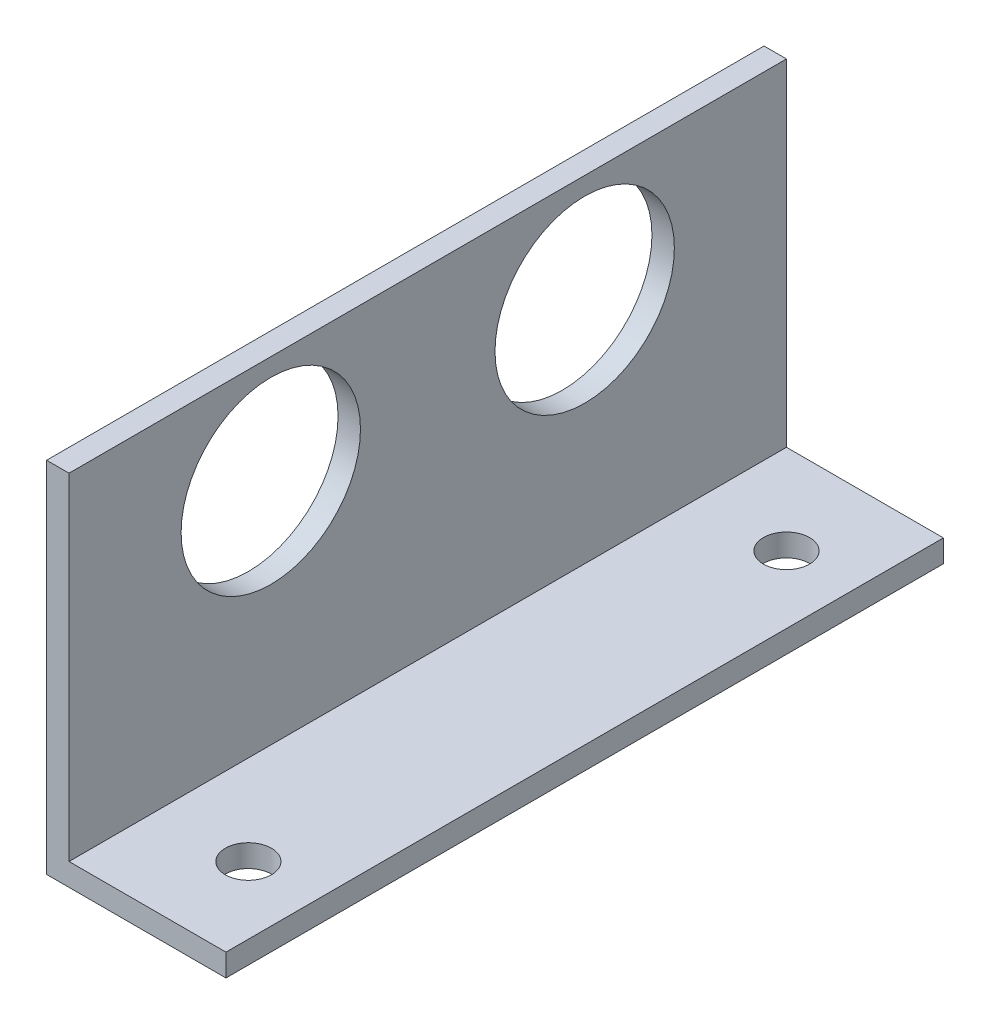
ISO-10303-21;
HEADER;
FILE_DESCRIPTION(('STEP AP214'),'2;1');
FILE_NAME('part.step','',(''),(''),'','','');
FILE_SCHEMA(('AUTOMOTIVE_DESIGN { 1 0 10303 214 1 1 1 1 }'));
ENDSEC;
DATA;
#1=APPLICATION_CONTEXT('core data for automotive mechanical design processes');
#2=APPLICATION_PROTOCOL_DEFINITION('international standard','automotive_design',2000,#1);
#3=PRODUCT_CONTEXT('',#1,'mechanical');
#4=PRODUCT('Part','Part','',(#3));
#5=PRODUCT_RELATED_PRODUCT_CATEGORY('part','',(#4));
#6=PRODUCT_DEFINITION_FORMATION('','',#4);
#7=PRODUCT_DEFINITION_CONTEXT('part definition',#1,'design');
#8=PRODUCT_DEFINITION('design','',#6,#7);
#9=PRODUCT_DEFINITION_SHAPE('','',#8);
#10=(LENGTH_UNIT() NAMED_UNIT(*) SI_UNIT(.MILLI.,.METRE.));
#11=(NAMED_UNIT(*) PLANE_ANGLE_UNIT() SI_UNIT($,.RADIAN.));
#12=(NAMED_UNIT(*) SI_UNIT($,.STERADIAN.) SOLID_ANGLE_UNIT());
#13=UNCERTAINTY_MEASURE_WITH_UNIT(LENGTH_MEASURE(1.E-05),#10,'distance_accuracy_value','');
#14=(GEOMETRIC_REPRESENTATION_CONTEXT(3) GLOBAL_UNCERTAINTY_ASSIGNED_CONTEXT((#13)) GLOBAL_UNIT_ASSIGNED_CONTEXT((#10,
#11,#12)) REPRESENTATION_CONTEXT('',''));
#15=CARTESIAN_POINT('',(0.,0.,0.));
#16=DIRECTION('',(0.,0.,1.));
#17=DIRECTION('',(1.,0.,0.));
#18=AXIS2_PLACEMENT_3D('',#15,#16,#17);
#19=CARTESIAN_POINT('',(0.,25.4,25.4));
#20=DIRECTION('',(1.,0.,0.));
#21=DIRECTION('',(0.,0.,-1.));
#22=AXIS2_PLACEMENT_3D('',#19,#20,#21);
#23=PLANE('',#22);
#24=CARTESIAN_POINT('',(0.,17.78,-11.1125));
#25=DIRECTION('',(-1.,0.,0.));
#26=DIRECTION('',(0.,0.,1.));
#27=AXIS2_PLACEMENT_3D('',#24,#25,#26);
#28=CIRCLE('',#27,6.35);
#29=CARTESIAN_POINT('',(0.,17.78,-4.7625));
#30=VERTEX_POINT('',#29);
#31=EDGE_CURVE('E144',#30,#30,#28,.T.);
#32=ORIENTED_EDGE('',*,*,#31,.F.);
#33=EDGE_LOOP('',(#32));
#34=FACE_BOUND('',#33,.T.);
#35=CARTESIAN_POINT('',(0.,17.78,11.1125));
#36=DIRECTION('',(-1.,0.,0.));
#37=DIRECTION('',(0.,0.,1.));
#38=AXIS2_PLACEMENT_3D('',#35,#36,#37);
#39=CIRCLE('',#38,6.35000000000001);
#40=CARTESIAN_POINT('',(0.,17.78,17.4625));
#41=VERTEX_POINT('',#40);
#42=EDGE_CURVE('E136',#41,#41,#39,.T.);
#43=ORIENTED_EDGE('',*,*,#42,.F.);
#44=EDGE_LOOP('',(#43));
#45=FACE_BOUND('',#44,.T.);
#46=DIRECTION('',(0.,-1.,0.));
#47=VECTOR('',#46,1.);
#48=CARTESIAN_POINT('',(0.,25.4,-25.4));
#49=LINE('',#48,#47);
#50=CARTESIAN_POINT('',(0.,25.4,-25.4));
#51=VERTEX_POINT('',#50);
#52=CARTESIAN_POINT('',(0.,0.,-25.4));
#53=VERTEX_POINT('',#52);
#54=EDGE_CURVE('E119',#51,#53,#49,.T.);
#55=ORIENTED_EDGE('',*,*,#54,.T.);
#56=DIRECTION('',(0.,0.,-1.));
#57=VECTOR('',#56,1.);
#58=CARTESIAN_POINT('',(0.,0.,25.4));
#59=LINE('',#58,#57);
#60=CARTESIAN_POINT('',(0.,0.,25.4));
#61=VERTEX_POINT('',#60);
#62=EDGE_CURVE('E11',#61,#53,#59,.T.);
#63=ORIENTED_EDGE('',*,*,#62,.F.);
#64=DIRECTION('',(0.,-1.,0.));
#65=VECTOR('',#64,1.);
#66=CARTESIAN_POINT('',(0.,25.4,25.4));
#67=LINE('',#66,#65);
#68=CARTESIAN_POINT('',(0.,25.4,25.4));
#69=VERTEX_POINT('',#68);
#70=EDGE_CURVE('E130',#69,#61,#67,.T.);
#71=ORIENTED_EDGE('',*,*,#70,.F.);
#72=DIRECTION('',(0.,0.,-1.));
#73=VECTOR('',#72,1.);
#74=CARTESIAN_POINT('',(0.,25.4,25.4));
#75=LINE('',#74,#73);
#76=EDGE_CURVE('E115',#69,#51,#75,.T.);
#77=ORIENTED_EDGE('',*,*,#76,.T.);
#78=EDGE_LOOP('',(#55,#63,#71,#77));
#79=FACE_BOUND('',#78,.T.);
#80=ADVANCED_FACE('F33',(#34,#45,#79),#23,.F.);
#81=CARTESIAN_POINT('',(0.,0.,25.4));
#82=DIRECTION('',(0.,1.,0.));
#83=DIRECTION('',(0.,0.,1.));
#84=AXIS2_PLACEMENT_3D('',#81,#82,#83);
#85=PLANE('',#84);
#86=CARTESIAN_POINT('',(7.9375,0.,-19.05));
#87=DIRECTION('',(0.,1.,0.));
#88=DIRECTION('',(0.,0.,1.));
#89=AXIS2_PLACEMENT_3D('',#86,#87,#88);
#90=CIRCLE('',#89,1.63195);
#91=CARTESIAN_POINT('',(7.9375,0.,-17.41805));
#92=VERTEX_POINT('',#91);
#93=EDGE_CURVE('E186',#92,#92,#90,.T.);
#94=ORIENTED_EDGE('',*,*,#93,.T.);
#95=EDGE_LOOP('',(#94));
#96=FACE_BOUND('',#95,.T.);
#97=CARTESIAN_POINT('',(7.9375,0.,19.05));
#98=DIRECTION('',(0.,1.,0.));
#99=DIRECTION('',(0.,0.,1.));
#100=AXIS2_PLACEMENT_3D('',#97,#98,#99);
#101=CIRCLE('',#100,1.63195);
#102=CARTESIAN_POINT('',(7.9375,0.,20.68195));
#103=VERTEX_POINT('',#102);
#104=EDGE_CURVE('E180',#103,#103,#101,.T.);
#105=ORIENTED_EDGE('',*,*,#104,.T.);
#106=EDGE_LOOP('',(#105));
#107=FACE_BOUND('',#106,.T.);
#108=DIRECTION('',(1.,0.,0.));
#109=VECTOR('',#108,1.);
#110=CARTESIAN_POINT('',(0.,0.,-25.4));
#111=LINE('',#110,#109);
#112=CARTESIAN_POINT('',(12.7,0.,-25.4));
#113=VERTEX_POINT('',#112);
#114=EDGE_CURVE('E122',#53,#113,#111,.T.);
#115=ORIENTED_EDGE('',*,*,#114,.T.);
#116=DIRECTION('',(0.,0.,-1.));
#117=VECTOR('',#116,1.);
#118=CARTESIAN_POINT('',(12.7,0.,25.4));
#119=LINE('',#118,#117);
#120=CARTESIAN_POINT('',(12.7,0.,25.4));
#121=VERTEX_POINT('',#120);
#122=EDGE_CURVE('E42',#121,#113,#119,.T.);
#123=ORIENTED_EDGE('',*,*,#122,.F.);
#124=DIRECTION('',(1.,0.,0.));
#125=VECTOR('',#124,1.);
#126=CARTESIAN_POINT('',(0.,0.,25.4));
#127=LINE('',#126,#125);
#128=EDGE_CURVE('E88',#61,#121,#127,.T.);
#129=ORIENTED_EDGE('',*,*,#128,.F.);
#130=ORIENTED_EDGE('',*,*,#62,.T.);
#131=EDGE_LOOP('',(#115,#123,#129,#130));
#132=FACE_BOUND('',#131,.T.);
#133=ADVANCED_FACE('F151',(#96,#107,#132),#85,.F.);
#134=CARTESIAN_POINT('',(12.7,0.,25.4));
#135=DIRECTION('',(-1.,0.,0.));
#136=DIRECTION('',(0.,0.,1.));
#137=AXIS2_PLACEMENT_3D('',#134,#135,#136);
#138=PLANE('',#137);
#139=DIRECTION('',(0.,1.,0.));
#140=VECTOR('',#139,1.);
#141=CARTESIAN_POINT('',(12.7,0.,-25.4));
#142=LINE('',#141,#140);
#143=CARTESIAN_POINT('',(12.7,1.5875,-25.4));
#144=VERTEX_POINT('',#143);
#145=EDGE_CURVE('E125',#113,#144,#142,.T.);
#146=ORIENTED_EDGE('',*,*,#145,.T.);
#147=DIRECTION('',(0.,0.,-1.));
#148=VECTOR('',#147,1.);
#149=CARTESIAN_POINT('',(12.7,1.5875,25.4));
#150=LINE('',#149,#148);
#151=CARTESIAN_POINT('',(12.7,1.5875,25.4));
#152=VERTEX_POINT('',#151);
#153=EDGE_CURVE('E110',#152,#144,#150,.T.);
#154=ORIENTED_EDGE('',*,*,#153,.F.);
#155=DIRECTION('',(0.,1.,0.));
#156=VECTOR('',#155,1.);
#157=CARTESIAN_POINT('',(12.7,0.,25.4));
#158=LINE('',#157,#156);
#159=EDGE_CURVE('E101',#121,#152,#158,.T.);
#160=ORIENTED_EDGE('',*,*,#159,.F.);
#161=ORIENTED_EDGE('',*,*,#122,.T.);
#162=EDGE_LOOP('',(#146,#154,#160,#161));
#163=FACE_BOUND('',#162,.T.);
#164=ADVANCED_FACE('F154',(#163),#138,.F.);
#165=CARTESIAN_POINT('',(12.7,1.5875,25.4));
#166=DIRECTION('',(0.,-1.,0.));
#167=DIRECTION('',(1.,0.,0.));
#168=AXIS2_PLACEMENT_3D('',#165,#166,#167);
#169=PLANE('',#168);
#170=CARTESIAN_POINT('',(7.9375,1.5875,-19.05));
#171=DIRECTION('',(0.,1.,0.));
#172=DIRECTION('',(0.,0.,1.));
#173=AXIS2_PLACEMENT_3D('',#170,#171,#172);
#174=CIRCLE('',#173,1.63195);
#175=CARTESIAN_POINT('',(7.9375,1.5875,-17.41805));
#176=VERTEX_POINT('',#175);
#177=EDGE_CURVE('E191',#176,#176,#174,.T.);
#178=ORIENTED_EDGE('',*,*,#177,.F.);
#179=EDGE_LOOP('',(#178));
#180=FACE_BOUND('',#179,.T.);
#181=CARTESIAN_POINT('',(7.9375,1.5875,19.05));
#182=DIRECTION('',(0.,1.,0.));
#183=DIRECTION('',(0.,0.,1.));
#184=AXIS2_PLACEMENT_3D('',#181,#182,#183);
#185=CIRCLE('',#184,1.63195);
#186=CARTESIAN_POINT('',(7.9375,1.5875,20.68195));
#187=VERTEX_POINT('',#186);
#188=EDGE_CURVE('E182',#187,#187,#185,.T.);
#189=ORIENTED_EDGE('',*,*,#188,.F.);
#190=EDGE_LOOP('',(#189));
#191=FACE_BOUND('',#190,.T.);
#192=DIRECTION('',(-1.,0.,0.));
#193=VECTOR('',#192,1.);
#194=CARTESIAN_POINT('',(12.7,1.5875,-25.4));
#195=LINE('',#194,#193);
#196=CARTESIAN_POINT('',(1.5875,1.5875,-25.4));
#197=VERTEX_POINT('',#196);
#198=EDGE_CURVE('E109',#144,#197,#195,.T.);
#199=ORIENTED_EDGE('',*,*,#198,.T.);
#200=DIRECTION('',(0.,0.,-1.));
#201=VECTOR('',#200,1.);
#202=CARTESIAN_POINT('',(1.5875,1.5875,25.4));
#203=LINE('',#202,#201);
#204=CARTESIAN_POINT('',(1.5875,1.5875,25.4));
#205=VERTEX_POINT('',#204);
#206=EDGE_CURVE('E106',#205,#197,#203,.T.);
#207=ORIENTED_EDGE('',*,*,#206,.F.);
#208=DIRECTION('',(-1.,0.,0.));
#209=VECTOR('',#208,1.);
#210=CARTESIAN_POINT('',(12.7,1.5875,25.4));
#211=LINE('',#210,#209);
#212=EDGE_CURVE('E95',#152,#205,#211,.T.);
#213=ORIENTED_EDGE('',*,*,#212,.F.);
#214=ORIENTED_EDGE('',*,*,#153,.T.);
#215=EDGE_LOOP('',(#199,#207,#213,#214));
#216=FACE_BOUND('',#215,.T.);
#217=ADVANCED_FACE('F107',(#180,#191,#216),#169,.F.);
#218=CARTESIAN_POINT('',(1.5875,1.5875,25.4));
#219=DIRECTION('',(-1.,0.,0.));
#220=DIRECTION('',(0.,-1.,0.));
#221=AXIS2_PLACEMENT_3D('',#218,#219,#220);
#222=PLANE('',#221);
#223=CARTESIAN_POINT('',(1.5875,17.78,-11.1125));
#224=DIRECTION('',(-1.,0.,0.));
#225=DIRECTION('',(0.,-1.,0.));
#226=AXIS2_PLACEMENT_3D('',#223,#224,#225);
#227=CIRCLE('',#226,6.35);
#228=CARTESIAN_POINT('',(1.5875,11.43,-11.1125));
#229=VERTEX_POINT('',#228);
#230=EDGE_CURVE('E36',#229,#229,#227,.T.);
#231=ORIENTED_EDGE('',*,*,#230,.T.);
#232=EDGE_LOOP('',(#231));
#233=FACE_BOUND('',#232,.T.);
#234=CARTESIAN_POINT('',(1.5875,17.78,11.1125));
#235=DIRECTION('',(-1.,0.,0.));
#236=DIRECTION('',(0.,-1.,0.));
#237=AXIS2_PLACEMENT_3D('',#234,#235,#236);
#238=CIRCLE('',#237,6.35000000000001);
#239=CARTESIAN_POINT('',(1.5875,11.43,11.1125));
#240=VERTEX_POINT('',#239);
#241=EDGE_CURVE('E123',#240,#240,#238,.T.);
#242=ORIENTED_EDGE('',*,*,#241,.T.);
#243=EDGE_LOOP('',(#242));
#244=FACE_BOUND('',#243,.T.);
#245=DIRECTION('',(0.,1.,0.));
#246=VECTOR('',#245,1.);
#247=CARTESIAN_POINT('',(1.5875,1.5875,-25.4));
#248=LINE('',#247,#246);
#249=CARTESIAN_POINT('',(1.5875,25.4,-25.4));
#250=VERTEX_POINT('',#249);
#251=EDGE_CURVE('E74',#197,#250,#248,.T.);
#252=ORIENTED_EDGE('',*,*,#251,.T.);
#253=DIRECTION('',(0.,0.,-1.));
#254=VECTOR('',#253,1.);
#255=CARTESIAN_POINT('',(1.5875,25.4,25.4));
#256=LINE('',#255,#254);
#257=CARTESIAN_POINT('',(1.5875,25.4,25.4));
#258=VERTEX_POINT('',#257);
#259=EDGE_CURVE('E111',#258,#250,#256,.T.);
#260=ORIENTED_EDGE('',*,*,#259,.F.);
#261=DIRECTION('',(0.,1.,0.));
#262=VECTOR('',#261,1.);
#263=CARTESIAN_POINT('',(1.5875,1.5875,25.4));
#264=LINE('',#263,#262);
#265=EDGE_CURVE('E99',#205,#258,#264,.T.);
#266=ORIENTED_EDGE('',*,*,#265,.F.);
#267=ORIENTED_EDGE('',*,*,#206,.T.);
#268=EDGE_LOOP('',(#252,#260,#266,#267));
#269=FACE_BOUND('',#268,.T.);
#270=ADVANCED_FACE('F113',(#233,#244,#269),#222,.F.);
#271=CARTESIAN_POINT('',(1.5875,25.4,25.4));
#272=DIRECTION('',(0.,-1.,0.));
#273=DIRECTION('',(0.,0.,-1.));
#274=AXIS2_PLACEMENT_3D('',#271,#272,#273);
#275=PLANE('',#274);
#276=DIRECTION('',(-1.,0.,0.));
#277=VECTOR('',#276,1.);
#278=CARTESIAN_POINT('',(1.5875,25.4,-25.4));
#279=LINE('',#278,#277);
#280=EDGE_CURVE('E80',#250,#51,#279,.T.);
#281=ORIENTED_EDGE('',*,*,#280,.T.);
#282=ORIENTED_EDGE('',*,*,#76,.F.);
#283=DIRECTION('',(-1.,0.,0.));
#284=VECTOR('',#283,1.);
#285=CARTESIAN_POINT('',(1.5875,25.4,25.4));
#286=LINE('',#285,#284);
#287=EDGE_CURVE('E51',#258,#69,#286,.T.);
#288=ORIENTED_EDGE('',*,*,#287,.F.);
#289=ORIENTED_EDGE('',*,*,#259,.T.);
#290=EDGE_LOOP('',(#281,#282,#288,#289));
#291=FACE_BOUND('',#290,.T.);
#292=ADVANCED_FACE('F159',(#291),#275,.F.);
#293=CARTESIAN_POINT('',(0.,0.,25.4));
#294=DIRECTION('',(0.,0.,1.));
#295=DIRECTION('',(1.,0.,0.));
#296=AXIS2_PLACEMENT_3D('',#293,#294,#295);
#297=PLANE('',#296);
#298=ORIENTED_EDGE('',*,*,#70,.T.);
#299=ORIENTED_EDGE('',*,*,#128,.T.);
#300=ORIENTED_EDGE('',*,*,#159,.T.);
#301=ORIENTED_EDGE('',*,*,#212,.T.);
#302=ORIENTED_EDGE('',*,*,#265,.T.);
#303=ORIENTED_EDGE('',*,*,#287,.T.);
#304=EDGE_LOOP('',(#298,#299,#300,#301,#302,#303));
#305=FACE_BOUND('',#304,.T.);
#306=ADVANCED_FACE('F97',(#305),#297,.T.);
#307=CARTESIAN_POINT('',(0.,0.,-25.4));
#308=DIRECTION('',(0.,0.,1.));
#309=DIRECTION('',(1.,0.,0.));
#310=AXIS2_PLACEMENT_3D('',#307,#308,#309);
#311=PLANE('',#310);
#312=ORIENTED_EDGE('',*,*,#54,.F.);
#313=ORIENTED_EDGE('',*,*,#280,.F.);
#314=ORIENTED_EDGE('',*,*,#251,.F.);
#315=ORIENTED_EDGE('',*,*,#198,.F.);
#316=ORIENTED_EDGE('',*,*,#145,.F.);
#317=ORIENTED_EDGE('',*,*,#114,.F.);
#318=EDGE_LOOP('',(#312,#313,#314,#315,#316,#317));
#319=FACE_BOUND('',#318,.T.);
#320=ADVANCED_FACE('F157',(#319),#311,.F.);
#321=CARTESIAN_POINT('',(12.7,17.78,11.1125));
#322=DIRECTION('',(-1.,0.,0.));
#323=DIRECTION('',(0.,0.,1.));
#324=AXIS2_PLACEMENT_3D('',#321,#322,#323);
#325=CYLINDRICAL_SURFACE('',#324,6.35000000000001);
#326=ORIENTED_EDGE('',*,*,#42,.T.);
#327=EDGE_LOOP('',(#326));
#328=FACE_BOUND('',#327,.T.);
#329=ORIENTED_EDGE('',*,*,#241,.F.);
#330=EDGE_LOOP('',(#329));
#331=FACE_BOUND('',#330,.T.);
#332=ADVANCED_FACE('F213',(#328,#331),#325,.F.);
#333=CARTESIAN_POINT('',(12.7,17.78,-11.1125));
#334=DIRECTION('',(-1.,0.,0.));
#335=DIRECTION('',(0.,0.,1.));
#336=AXIS2_PLACEMENT_3D('',#333,#334,#335);
#337=CYLINDRICAL_SURFACE('',#336,6.35);
#338=ORIENTED_EDGE('',*,*,#31,.T.);
#339=EDGE_LOOP('',(#338));
#340=FACE_BOUND('',#339,.T.);
#341=ORIENTED_EDGE('',*,*,#230,.F.);
#342=EDGE_LOOP('',(#341));
#343=FACE_BOUND('',#342,.T.);
#344=ADVANCED_FACE('F206',(#340,#343),#337,.F.);
#345=CARTESIAN_POINT('',(7.9375,1.5875,19.05));
#346=DIRECTION('',(0.,1.,0.));
#347=DIRECTION('',(0.,0.,1.));
#348=AXIS2_PLACEMENT_3D('',#345,#346,#347);
#349=CYLINDRICAL_SURFACE('',#348,1.63195);
#350=ORIENTED_EDGE('',*,*,#188,.T.);
#351=EDGE_LOOP('',(#350));
#352=FACE_BOUND('',#351,.T.);
#353=ORIENTED_EDGE('',*,*,#104,.F.);
#354=EDGE_LOOP('',(#353));
#355=FACE_BOUND('',#354,.T.);
#356=ADVANCED_FACE('F203',(#352,#355),#349,.F.);
#357=CARTESIAN_POINT('',(7.9375,1.5875,-19.05));
#358=DIRECTION('',(0.,1.,0.));
#359=DIRECTION('',(0.,0.,1.));
#360=AXIS2_PLACEMENT_3D('',#357,#358,#359);
#361=CYLINDRICAL_SURFACE('',#360,1.63195);
#362=ORIENTED_EDGE('',*,*,#177,.T.);
#363=EDGE_LOOP('',(#362));
#364=FACE_BOUND('',#363,.T.);
#365=ORIENTED_EDGE('',*,*,#93,.F.);
#366=EDGE_LOOP('',(#365));
#367=FACE_BOUND('',#366,.T.);
#368=ADVANCED_FACE('F195',(#364,#367),#361,.F.);
#369=CLOSED_SHELL('',(#80,#133,#164,#217,#270,#292,#306,#320,#332,#344,#356,#368));
#370=MANIFOLD_SOLID_BREP('B2',#369);
#371=ADVANCED_BREP_SHAPE_REPRESENTATION('',(#18,#370),#14);
#372=SHAPE_DEFINITION_REPRESENTATION(#9,#371);
ENDSEC;
END-ISO-10303-21;
